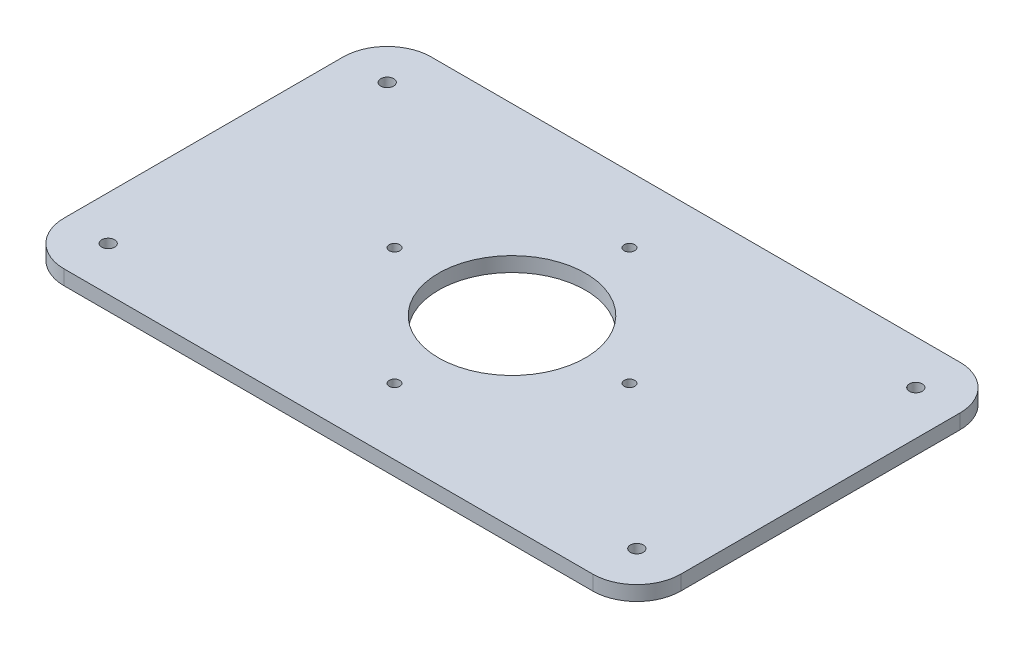
ISO-10303-21;
HEADER;
FILE_DESCRIPTION(('STEP AP214'),'2;1');
FILE_NAME('part.step','',(''),(''),'','','');
FILE_SCHEMA(('AUTOMOTIVE_DESIGN { 1 0 10303 214 1 1 1 1 }'));
ENDSEC;
DATA;
#1=APPLICATION_CONTEXT('core data for automotive mechanical design processes');
#2=APPLICATION_PROTOCOL_DEFINITION('international standard','automotive_design',2000,#1);
#3=PRODUCT_CONTEXT('',#1,'mechanical');
#4=PRODUCT('Part','Part','',(#3));
#5=PRODUCT_RELATED_PRODUCT_CATEGORY('part','',(#4));
#6=PRODUCT_DEFINITION_FORMATION('','',#4);
#7=PRODUCT_DEFINITION_CONTEXT('part definition',#1,'design');
#8=PRODUCT_DEFINITION('design','',#6,#7);
#9=PRODUCT_DEFINITION_SHAPE('','',#8);
#10=(LENGTH_UNIT() NAMED_UNIT(*) SI_UNIT(.MILLI.,.METRE.));
#11=(NAMED_UNIT(*) PLANE_ANGLE_UNIT() SI_UNIT($,.RADIAN.));
#12=(NAMED_UNIT(*) SI_UNIT($,.STERADIAN.) SOLID_ANGLE_UNIT());
#13=UNCERTAINTY_MEASURE_WITH_UNIT(LENGTH_MEASURE(1.E-05),#10,'distance_accuracy_value','');
#14=(GEOMETRIC_REPRESENTATION_CONTEXT(3) GLOBAL_UNCERTAINTY_ASSIGNED_CONTEXT((#13)) GLOBAL_UNIT_ASSIGNED_CONTEXT((#10,
#11,#12)) REPRESENTATION_CONTEXT('',''));
#15=CARTESIAN_POINT('',(0.,0.,0.));
#16=DIRECTION('',(0.,0.,1.));
#17=DIRECTION('',(1.,0.,0.));
#18=AXIS2_PLACEMENT_3D('',#15,#16,#17);
#19=CARTESIAN_POINT('',(0.,5.,0.));
#20=DIRECTION('',(0.,1.,0.));
#21=DIRECTION('',(0.,0.,1.));
#22=AXIS2_PLACEMENT_3D('',#19,#20,#21);
#23=PLANE('',#22);
#24=CARTESIAN_POINT('',(-90.,5.,47.5));
#25=DIRECTION('',(0.,1.,0.));
#26=DIRECTION('',(0.,0.,-1.));
#27=AXIS2_PLACEMENT_3D('',#24,#25,#26);
#28=CIRCLE('',#27,2.20000000000521);
#29=CARTESIAN_POINT('',(-90.,5.,45.2999999999948));
#30=VERTEX_POINT('',#29);
#31=EDGE_CURVE('E219',#30,#30,#28,.T.);
#32=ORIENTED_EDGE('',*,*,#31,.F.);
#33=EDGE_LOOP('',(#32));
#34=FACE_BOUND('',#33,.T.);
#35=CARTESIAN_POINT('',(90.0000000000001,5.,47.5));
#36=DIRECTION('',(0.,1.,0.));
#37=DIRECTION('',(0.,0.,1.));
#38=AXIS2_PLACEMENT_3D('',#35,#36,#37);
#39=CIRCLE('',#38,2.20000000000521);
#40=CARTESIAN_POINT('',(90.0000000000001,5.,49.7000000000053));
#41=VERTEX_POINT('',#40);
#42=EDGE_CURVE('E225',#41,#41,#39,.T.);
#43=ORIENTED_EDGE('',*,*,#42,.F.);
#44=EDGE_LOOP('',(#43));
#45=FACE_BOUND('',#44,.T.);
#46=CARTESIAN_POINT('',(90.0000000000001,5.,-47.5));
#47=DIRECTION('',(0.,1.,0.));
#48=DIRECTION('',(0.,0.,-1.));
#49=AXIS2_PLACEMENT_3D('',#46,#47,#48);
#50=CIRCLE('',#49,2.20000000000521);
#51=CARTESIAN_POINT('',(90.0000000000001,5.,-49.7000000000053));
#52=VERTEX_POINT('',#51);
#53=EDGE_CURVE('E213',#52,#52,#50,.T.);
#54=ORIENTED_EDGE('',*,*,#53,.F.);
#55=EDGE_LOOP('',(#54));
#56=FACE_BOUND('',#55,.T.);
#57=CARTESIAN_POINT('',(-90.,5.,-47.5));
#58=DIRECTION('',(0.,1.,0.));
#59=DIRECTION('',(0.,0.,1.));
#60=AXIS2_PLACEMENT_3D('',#57,#58,#59);
#61=CIRCLE('',#60,2.20000000000521);
#62=CARTESIAN_POINT('',(-90.,5.,-45.2999999999948));
#63=VERTEX_POINT('',#62);
#64=EDGE_CURVE('E210',#63,#63,#61,.T.);
#65=ORIENTED_EDGE('',*,*,#64,.F.);
#66=EDGE_LOOP('',(#65));
#67=FACE_BOUND('',#66,.T.);
#68=CARTESIAN_POINT('',(0.,5.,-40.));
#69=DIRECTION('',(0.,1.,0.));
#70=DIRECTION('',(0.,0.,1.));
#71=AXIS2_PLACEMENT_3D('',#68,#69,#70);
#72=CIRCLE('',#71,1.8);
#73=CARTESIAN_POINT('',(0.,5.,-38.2));
#74=VERTEX_POINT('',#73);
#75=EDGE_CURVE('E145',#74,#74,#72,.T.);
#76=ORIENTED_EDGE('',*,*,#75,.F.);
#77=EDGE_LOOP('',(#76));
#78=FACE_BOUND('',#77,.T.);
#79=CARTESIAN_POINT('',(40.0000000000013,5.,-1.32092536198717E-12));
#80=DIRECTION('',(0.,1.,0.));
#81=DIRECTION('',(0.,0.,1.));
#82=AXIS2_PLACEMENT_3D('',#79,#80,#81);
#83=CIRCLE('',#82,1.8);
#84=CARTESIAN_POINT('',(40.0000000000013,5.,1.79999999999868));
#85=VERTEX_POINT('',#84);
#86=EDGE_CURVE('E148',#85,#85,#83,.T.);
#87=ORIENTED_EDGE('',*,*,#86,.F.);
#88=EDGE_LOOP('',(#87));
#89=FACE_BOUND('',#88,.T.);
#90=CARTESIAN_POINT('',(2.64484859067624E-12,5.,40.));
#91=DIRECTION('',(0.,1.,0.));
#92=DIRECTION('',(0.,0.,1.));
#93=AXIS2_PLACEMENT_3D('',#90,#91,#92);
#94=CIRCLE('',#93,1.8);
#95=CARTESIAN_POINT('',(2.64484859067624E-12,5.,41.8));
#96=VERTEX_POINT('',#95);
#97=EDGE_CURVE('E154',#96,#96,#94,.T.);
#98=ORIENTED_EDGE('',*,*,#97,.F.);
#99=EDGE_LOOP('',(#98));
#100=FACE_BOUND('',#99,.T.);
#101=CARTESIAN_POINT('',(-39.9999999999987,5.,1.32582394918376E-12));
#102=DIRECTION('',(0.,1.,0.));
#103=DIRECTION('',(0.,0.,1.));
#104=AXIS2_PLACEMENT_3D('',#101,#102,#103);
#105=CIRCLE('',#104,1.8);
#106=CARTESIAN_POINT('',(-39.9999999999987,5.,1.80000000000133));
#107=VERTEX_POINT('',#106);
#108=EDGE_CURVE('E160',#107,#107,#105,.T.);
#109=ORIENTED_EDGE('',*,*,#108,.F.);
#110=EDGE_LOOP('',(#109));
#111=FACE_BOUND('',#110,.T.);
#112=CARTESIAN_POINT('',(0.,5.,0.));
#113=DIRECTION('',(0.,1.,0.));
#114=DIRECTION('',(0.,0.,1.));
#115=AXIS2_PLACEMENT_3D('',#112,#113,#114);
#116=CIRCLE('',#115,25.);
#117=CARTESIAN_POINT('',(0.,5.,25.));
#118=VERTEX_POINT('',#117);
#119=EDGE_CURVE('E167',#118,#118,#116,.T.);
#120=ORIENTED_EDGE('',*,*,#119,.F.);
#121=EDGE_LOOP('',(#120));
#122=FACE_BOUND('',#121,.T.);
#123=DIRECTION('',(0.,0.,1.));
#124=VECTOR('',#123,1.);
#125=CARTESIAN_POINT('',(-105.,5.,-62.5));
#126=LINE('',#125,#124);
#127=CARTESIAN_POINT('',(-105.,5.,-47.5));
#128=VERTEX_POINT('',#127);
#129=CARTESIAN_POINT('',(-105.,5.,47.5));
#130=VERTEX_POINT('',#129);
#131=EDGE_CURVE('E140',#128,#130,#126,.T.);
#132=ORIENTED_EDGE('',*,*,#131,.T.);
#133=CARTESIAN_POINT('',(-90.,5.,47.5));
#134=DIRECTION('',(0.,1.,0.));
#135=DIRECTION('',(0.,0.,1.));
#136=AXIS2_PLACEMENT_3D('',#133,#134,#135);
#137=CIRCLE('',#136,15.);
#138=CARTESIAN_POINT('',(-90.,5.,62.5));
#139=VERTEX_POINT('',#138);
#140=EDGE_CURVE('E185',#130,#139,#137,.T.);
#141=ORIENTED_EDGE('',*,*,#140,.T.);
#142=DIRECTION('',(1.,0.,0.));
#143=VECTOR('',#142,1.);
#144=CARTESIAN_POINT('',(-105.,5.,62.5));
#145=LINE('',#144,#143);
#146=CARTESIAN_POINT('',(90.,5.,62.5));
#147=VERTEX_POINT('',#146);
#148=EDGE_CURVE('E123',#139,#147,#145,.T.);
#149=ORIENTED_EDGE('',*,*,#148,.T.);
#150=CARTESIAN_POINT('',(90.,5.,47.5));
#151=DIRECTION('',(0.,1.,0.));
#152=DIRECTION('',(0.,0.,1.));
#153=AXIS2_PLACEMENT_3D('',#150,#151,#152);
#154=CIRCLE('',#153,15.);
#155=CARTESIAN_POINT('',(105.,5.,47.5));
#156=VERTEX_POINT('',#155);
#157=EDGE_CURVE('E183',#147,#156,#154,.T.);
#158=ORIENTED_EDGE('',*,*,#157,.T.);
#159=DIRECTION('',(0.,0.,-1.));
#160=VECTOR('',#159,1.);
#161=CARTESIAN_POINT('',(105.,5.,-62.5));
#162=LINE('',#161,#160);
#163=CARTESIAN_POINT('',(105.,5.,-47.5));
#164=VERTEX_POINT('',#163);
#165=EDGE_CURVE('E196',#156,#164,#162,.T.);
#166=ORIENTED_EDGE('',*,*,#165,.T.);
#167=CARTESIAN_POINT('',(90.,5.,-47.5));
#168=DIRECTION('',(0.,1.,0.));
#169=DIRECTION('',(0.,0.,1.));
#170=AXIS2_PLACEMENT_3D('',#167,#168,#169);
#171=CIRCLE('',#170,15.);
#172=CARTESIAN_POINT('',(90.,5.,-62.5));
#173=VERTEX_POINT('',#172);
#174=EDGE_CURVE('E58',#164,#173,#171,.T.);
#175=ORIENTED_EDGE('',*,*,#174,.T.);
#176=DIRECTION('',(-1.,0.,0.));
#177=VECTOR('',#176,1.);
#178=CARTESIAN_POINT('',(-105.,5.,-62.5));
#179=LINE('',#178,#177);
#180=CARTESIAN_POINT('',(-90.,5.,-62.5));
#181=VERTEX_POINT('',#180);
#182=EDGE_CURVE('E166',#173,#181,#179,.T.);
#183=ORIENTED_EDGE('',*,*,#182,.T.);
#184=CARTESIAN_POINT('',(-90.,5.,-47.5));
#185=DIRECTION('',(0.,1.,0.));
#186=DIRECTION('',(0.,0.,1.));
#187=AXIS2_PLACEMENT_3D('',#184,#185,#186);
#188=CIRCLE('',#187,15.);
#189=EDGE_CURVE('E180',#181,#128,#188,.T.);
#190=ORIENTED_EDGE('',*,*,#189,.T.);
#191=EDGE_LOOP('',(#132,#141,#149,#158,#166,#175,#183,#190));
#192=FACE_BOUND('',#191,.T.);
#193=ADVANCED_FACE('F37',(#34,#45,#56,#67,#78,#89,#100,#111,#122,#192),#23,.T.);
#194=CARTESIAN_POINT('',(0.,0.,0.));
#195=DIRECTION('',(0.,1.,0.));
#196=DIRECTION('',(0.,0.,1.));
#197=AXIS2_PLACEMENT_3D('',#194,#195,#196);
#198=PLANE('',#197);
#199=CARTESIAN_POINT('',(-90.,0.,47.5));
#200=DIRECTION('',(0.,1.,0.));
#201=DIRECTION('',(0.,0.,-1.));
#202=AXIS2_PLACEMENT_3D('',#199,#200,#201);
#203=CIRCLE('',#202,2.20000000000521);
#204=CARTESIAN_POINT('',(-90.,0.,45.2999999999948));
#205=VERTEX_POINT('',#204);
#206=EDGE_CURVE('E216',#205,#205,#203,.T.);
#207=ORIENTED_EDGE('',*,*,#206,.T.);
#208=EDGE_LOOP('',(#207));
#209=FACE_BOUND('',#208,.T.);
#210=CARTESIAN_POINT('',(90.0000000000001,0.,47.5));
#211=DIRECTION('',(0.,1.,0.));
#212=DIRECTION('',(0.,0.,1.));
#213=AXIS2_PLACEMENT_3D('',#210,#211,#212);
#214=CIRCLE('',#213,2.20000000000521);
#215=CARTESIAN_POINT('',(90.0000000000001,0.,49.7000000000053));
#216=VERTEX_POINT('',#215);
#217=EDGE_CURVE('E222',#216,#216,#214,.T.);
#218=ORIENTED_EDGE('',*,*,#217,.T.);
#219=EDGE_LOOP('',(#218));
#220=FACE_BOUND('',#219,.T.);
#221=CARTESIAN_POINT('',(90.0000000000001,0.,-47.5));
#222=DIRECTION('',(0.,1.,0.));
#223=DIRECTION('',(0.,0.,-1.));
#224=AXIS2_PLACEMENT_3D('',#221,#222,#223);
#225=CIRCLE('',#224,2.20000000000521);
#226=CARTESIAN_POINT('',(90.0000000000001,0.,-49.7000000000053));
#227=VERTEX_POINT('',#226);
#228=EDGE_CURVE('E228',#227,#227,#225,.T.);
#229=ORIENTED_EDGE('',*,*,#228,.T.);
#230=EDGE_LOOP('',(#229));
#231=FACE_BOUND('',#230,.T.);
#232=CARTESIAN_POINT('',(-90.,0.,-47.5));
#233=DIRECTION('',(0.,1.,0.));
#234=DIRECTION('',(0.,0.,1.));
#235=AXIS2_PLACEMENT_3D('',#232,#233,#234);
#236=CIRCLE('',#235,2.20000000000521);
#237=CARTESIAN_POINT('',(-90.,0.,-45.2999999999948));
#238=VERTEX_POINT('',#237);
#239=EDGE_CURVE('E135',#238,#238,#236,.T.);
#240=ORIENTED_EDGE('',*,*,#239,.T.);
#241=EDGE_LOOP('',(#240));
#242=FACE_BOUND('',#241,.T.);
#243=CARTESIAN_POINT('',(0.,0.,-40.));
#244=DIRECTION('',(0.,1.,0.));
#245=DIRECTION('',(0.,0.,1.));
#246=AXIS2_PLACEMENT_3D('',#243,#244,#245);
#247=CIRCLE('',#246,1.8);
#248=CARTESIAN_POINT('',(0.,0.,-38.2));
#249=VERTEX_POINT('',#248);
#250=EDGE_CURVE('E141',#249,#249,#247,.T.);
#251=ORIENTED_EDGE('',*,*,#250,.T.);
#252=EDGE_LOOP('',(#251));
#253=FACE_BOUND('',#252,.T.);
#254=CARTESIAN_POINT('',(40.0000000000013,0.,-1.32092536198717E-12));
#255=DIRECTION('',(0.,1.,0.));
#256=DIRECTION('',(0.,0.,1.));
#257=AXIS2_PLACEMENT_3D('',#254,#255,#256);
#258=CIRCLE('',#257,1.8);
#259=CARTESIAN_POINT('',(40.0000000000013,0.,1.79999999999868));
#260=VERTEX_POINT('',#259);
#261=EDGE_CURVE('E151',#260,#260,#258,.T.);
#262=ORIENTED_EDGE('',*,*,#261,.T.);
#263=EDGE_LOOP('',(#262));
#264=FACE_BOUND('',#263,.T.);
#265=CARTESIAN_POINT('',(2.64484859067624E-12,0.,40.));
#266=DIRECTION('',(0.,1.,0.));
#267=DIRECTION('',(0.,0.,1.));
#268=AXIS2_PLACEMENT_3D('',#265,#266,#267);
#269=CIRCLE('',#268,1.8);
#270=CARTESIAN_POINT('',(2.64484859067624E-12,0.,41.8));
#271=VERTEX_POINT('',#270);
#272=EDGE_CURVE('E157',#271,#271,#269,.T.);
#273=ORIENTED_EDGE('',*,*,#272,.T.);
#274=EDGE_LOOP('',(#273));
#275=FACE_BOUND('',#274,.T.);
#276=CARTESIAN_POINT('',(-39.9999999999987,0.,1.32582394918376E-12));
#277=DIRECTION('',(0.,1.,0.));
#278=DIRECTION('',(0.,0.,1.));
#279=AXIS2_PLACEMENT_3D('',#276,#277,#278);
#280=CIRCLE('',#279,1.8);
#281=CARTESIAN_POINT('',(-39.9999999999987,0.,1.80000000000133));
#282=VERTEX_POINT('',#281);
#283=EDGE_CURVE('E163',#282,#282,#280,.T.);
#284=ORIENTED_EDGE('',*,*,#283,.T.);
#285=EDGE_LOOP('',(#284));
#286=FACE_BOUND('',#285,.T.);
#287=CARTESIAN_POINT('',(0.,0.,0.));
#288=DIRECTION('',(0.,1.,0.));
#289=DIRECTION('',(0.,0.,1.));
#290=AXIS2_PLACEMENT_3D('',#287,#288,#289);
#291=CIRCLE('',#290,25.);
#292=CARTESIAN_POINT('',(0.,0.,25.));
#293=VERTEX_POINT('',#292);
#294=EDGE_CURVE('E144',#293,#293,#291,.T.);
#295=ORIENTED_EDGE('',*,*,#294,.T.);
#296=EDGE_LOOP('',(#295));
#297=FACE_BOUND('',#296,.T.);
#298=DIRECTION('',(1.,0.,0.));
#299=VECTOR('',#298,1.);
#300=CARTESIAN_POINT('',(-105.,0.,62.5));
#301=LINE('',#300,#299);
#302=CARTESIAN_POINT('',(-90.,0.,62.5));
#303=VERTEX_POINT('',#302);
#304=CARTESIAN_POINT('',(90.,0.,62.5));
#305=VERTEX_POINT('',#304);
#306=EDGE_CURVE('E120',#303,#305,#301,.T.);
#307=ORIENTED_EDGE('',*,*,#306,.F.);
#308=CARTESIAN_POINT('',(-90.,0.,47.5));
#309=DIRECTION('',(0.,1.,0.));
#310=DIRECTION('',(0.,0.,1.));
#311=AXIS2_PLACEMENT_3D('',#308,#309,#310);
#312=CIRCLE('',#311,15.);
#313=CARTESIAN_POINT('',(-105.,0.,47.5));
#314=VERTEX_POINT('',#313);
#315=EDGE_CURVE('E103',#303,#314,#312,.F.);
#316=ORIENTED_EDGE('',*,*,#315,.T.);
#317=DIRECTION('',(0.,0.,1.));
#318=VECTOR('',#317,1.);
#319=CARTESIAN_POINT('',(-105.,0.,-62.5));
#320=LINE('',#319,#318);
#321=CARTESIAN_POINT('',(-105.,0.,-47.5));
#322=VERTEX_POINT('',#321);
#323=EDGE_CURVE('E130',#322,#314,#320,.T.);
#324=ORIENTED_EDGE('',*,*,#323,.F.);
#325=CARTESIAN_POINT('',(-90.,0.,-47.5));
#326=DIRECTION('',(0.,1.,0.));
#327=DIRECTION('',(0.,0.,1.));
#328=AXIS2_PLACEMENT_3D('',#325,#326,#327);
#329=CIRCLE('',#328,15.);
#330=CARTESIAN_POINT('',(-90.,0.,-62.5));
#331=VERTEX_POINT('',#330);
#332=EDGE_CURVE('E124',#322,#331,#329,.F.);
#333=ORIENTED_EDGE('',*,*,#332,.T.);
#334=DIRECTION('',(-1.,0.,0.));
#335=VECTOR('',#334,1.);
#336=CARTESIAN_POINT('',(-105.,0.,-62.5));
#337=LINE('',#336,#335);
#338=CARTESIAN_POINT('',(90.,0.,-62.5));
#339=VERTEX_POINT('',#338);
#340=EDGE_CURVE('E133',#339,#331,#337,.T.);
#341=ORIENTED_EDGE('',*,*,#340,.F.);
#342=CARTESIAN_POINT('',(90.,0.,-47.5));
#343=DIRECTION('',(0.,1.,0.));
#344=DIRECTION('',(0.,0.,1.));
#345=AXIS2_PLACEMENT_3D('',#342,#343,#344);
#346=CIRCLE('',#345,15.);
#347=CARTESIAN_POINT('',(105.,0.,-47.5));
#348=VERTEX_POINT('',#347);
#349=EDGE_CURVE('E174',#339,#348,#346,.F.);
#350=ORIENTED_EDGE('',*,*,#349,.T.);
#351=DIRECTION('',(0.,0.,-1.));
#352=VECTOR('',#351,1.);
#353=CARTESIAN_POINT('',(105.,0.,-62.5));
#354=LINE('',#353,#352);
#355=CARTESIAN_POINT('',(105.,0.,47.5));
#356=VERTEX_POINT('',#355);
#357=EDGE_CURVE('E129',#356,#348,#354,.T.);
#358=ORIENTED_EDGE('',*,*,#357,.F.);
#359=CARTESIAN_POINT('',(90.,0.,47.5));
#360=DIRECTION('',(0.,1.,0.));
#361=DIRECTION('',(0.,0.,1.));
#362=AXIS2_PLACEMENT_3D('',#359,#360,#361);
#363=CIRCLE('',#362,15.);
#364=EDGE_CURVE('E114',#356,#305,#363,.F.);
#365=ORIENTED_EDGE('',*,*,#364,.T.);
#366=EDGE_LOOP('',(#307,#316,#324,#333,#341,#350,#358,#365));
#367=FACE_BOUND('',#366,.T.);
#368=ADVANCED_FACE('F127',(#209,#220,#231,#242,#253,#264,#275,#286,#297,#367),#198,.F.);
#369=CARTESIAN_POINT('',(0.,5.,0.));
#370=DIRECTION('',(0.,-1.,0.));
#371=DIRECTION('',(0.,0.,-1.));
#372=AXIS2_PLACEMENT_3D('',#369,#370,#371);
#373=CYLINDRICAL_SURFACE('',#372,25.);
#374=ORIENTED_EDGE('',*,*,#119,.T.);
#375=EDGE_LOOP('',(#374));
#376=FACE_BOUND('',#375,.T.);
#377=ORIENTED_EDGE('',*,*,#294,.F.);
#378=EDGE_LOOP('',(#377));
#379=FACE_BOUND('',#378,.T.);
#380=ADVANCED_FACE('F270',(#376,#379),#373,.F.);
#381=CARTESIAN_POINT('',(-39.9999999999987,0.,1.32582394918376E-12));
#382=DIRECTION('',(0.,1.,0.));
#383=DIRECTION('',(0.,0.,1.));
#384=AXIS2_PLACEMENT_3D('',#381,#382,#383);
#385=CYLINDRICAL_SURFACE('',#384,1.8);
#386=ORIENTED_EDGE('',*,*,#283,.F.);
#387=EDGE_LOOP('',(#386));
#388=FACE_BOUND('',#387,.T.);
#389=ORIENTED_EDGE('',*,*,#108,.T.);
#390=EDGE_LOOP('',(#389));
#391=FACE_BOUND('',#390,.T.);
#392=ADVANCED_FACE('F275',(#388,#391),#385,.F.);
#393=CARTESIAN_POINT('',(2.64484859067624E-12,0.,40.));
#394=DIRECTION('',(0.,1.,0.));
#395=DIRECTION('',(0.,0.,1.));
#396=AXIS2_PLACEMENT_3D('',#393,#394,#395);
#397=CYLINDRICAL_SURFACE('',#396,1.8);
#398=ORIENTED_EDGE('',*,*,#272,.F.);
#399=EDGE_LOOP('',(#398));
#400=FACE_BOUND('',#399,.T.);
#401=ORIENTED_EDGE('',*,*,#97,.T.);
#402=EDGE_LOOP('',(#401));
#403=FACE_BOUND('',#402,.T.);
#404=ADVANCED_FACE('F279',(#400,#403),#397,.F.);
#405=CARTESIAN_POINT('',(40.0000000000013,0.,-1.32092536198717E-12));
#406=DIRECTION('',(0.,1.,0.));
#407=DIRECTION('',(0.,0.,1.));
#408=AXIS2_PLACEMENT_3D('',#405,#406,#407);
#409=CYLINDRICAL_SURFACE('',#408,1.8);
#410=ORIENTED_EDGE('',*,*,#261,.F.);
#411=EDGE_LOOP('',(#410));
#412=FACE_BOUND('',#411,.T.);
#413=ORIENTED_EDGE('',*,*,#86,.T.);
#414=EDGE_LOOP('',(#413));
#415=FACE_BOUND('',#414,.T.);
#416=ADVANCED_FACE('F283',(#412,#415),#409,.F.);
#417=CARTESIAN_POINT('',(0.,0.,-40.));
#418=DIRECTION('',(0.,1.,0.));
#419=DIRECTION('',(0.,0.,1.));
#420=AXIS2_PLACEMENT_3D('',#417,#418,#419);
#421=CYLINDRICAL_SURFACE('',#420,1.8);
#422=ORIENTED_EDGE('',*,*,#250,.F.);
#423=EDGE_LOOP('',(#422));
#424=FACE_BOUND('',#423,.T.);
#425=ORIENTED_EDGE('',*,*,#75,.T.);
#426=EDGE_LOOP('',(#425));
#427=FACE_BOUND('',#426,.T.);
#428=ADVANCED_FACE('F287',(#424,#427),#421,.F.);
#429=CARTESIAN_POINT('',(-105.,5.,-62.5));
#430=DIRECTION('',(1.,0.,0.));
#431=DIRECTION('',(0.,0.,-1.));
#432=AXIS2_PLACEMENT_3D('',#429,#430,#431);
#433=PLANE('',#432);
#434=ORIENTED_EDGE('',*,*,#323,.T.);
#435=DIRECTION('',(0.,-1.,0.));
#436=VECTOR('',#435,1.);
#437=CARTESIAN_POINT('',(-105.,5.,47.5));
#438=LINE('',#437,#436);
#439=EDGE_CURVE('E108',#314,#130,#438,.F.);
#440=ORIENTED_EDGE('',*,*,#439,.T.);
#441=ORIENTED_EDGE('',*,*,#131,.F.);
#442=DIRECTION('',(0.,-1.,0.));
#443=VECTOR('',#442,1.);
#444=CARTESIAN_POINT('',(-105.,5.,-47.5));
#445=LINE('',#444,#443);
#446=EDGE_CURVE('E113',#128,#322,#445,.T.);
#447=ORIENTED_EDGE('',*,*,#446,.T.);
#448=EDGE_LOOP('',(#434,#440,#441,#447));
#449=FACE_BOUND('',#448,.T.);
#450=ADVANCED_FACE('F254',(#449),#433,.F.);
#451=CARTESIAN_POINT('',(-105.,5.,62.5));
#452=DIRECTION('',(0.,0.,-1.));
#453=DIRECTION('',(-1.,0.,0.));
#454=AXIS2_PLACEMENT_3D('',#451,#452,#453);
#455=PLANE('',#454);
#456=ORIENTED_EDGE('',*,*,#148,.F.);
#457=DIRECTION('',(0.,-1.,0.));
#458=VECTOR('',#457,1.);
#459=CARTESIAN_POINT('',(-90.,5.,62.5));
#460=LINE('',#459,#458);
#461=EDGE_CURVE('E107',#139,#303,#460,.T.);
#462=ORIENTED_EDGE('',*,*,#461,.T.);
#463=ORIENTED_EDGE('',*,*,#306,.T.);
#464=DIRECTION('',(0.,-1.,0.));
#465=VECTOR('',#464,1.);
#466=CARTESIAN_POINT('',(90.,5.,62.5));
#467=LINE('',#466,#465);
#468=EDGE_CURVE('E125',#305,#147,#467,.F.);
#469=ORIENTED_EDGE('',*,*,#468,.T.);
#470=EDGE_LOOP('',(#456,#462,#463,#469));
#471=FACE_BOUND('',#470,.T.);
#472=ADVANCED_FACE('F119',(#471),#455,.F.);
#473=CARTESIAN_POINT('',(105.,5.,-62.5));
#474=DIRECTION('',(-1.,0.,0.));
#475=DIRECTION('',(0.,0.,1.));
#476=AXIS2_PLACEMENT_3D('',#473,#474,#475);
#477=PLANE('',#476);
#478=ORIENTED_EDGE('',*,*,#165,.F.);
#479=DIRECTION('',(0.,-1.,0.));
#480=VECTOR('',#479,1.);
#481=CARTESIAN_POINT('',(105.,5.,47.5));
#482=LINE('',#481,#480);
#483=EDGE_CURVE('E189',#156,#356,#482,.T.);
#484=ORIENTED_EDGE('',*,*,#483,.T.);
#485=ORIENTED_EDGE('',*,*,#357,.T.);
#486=DIRECTION('',(0.,-1.,0.));
#487=VECTOR('',#486,1.);
#488=CARTESIAN_POINT('',(105.,5.,-47.5));
#489=LINE('',#488,#487);
#490=EDGE_CURVE('E187',#348,#164,#489,.F.);
#491=ORIENTED_EDGE('',*,*,#490,.T.);
#492=EDGE_LOOP('',(#478,#484,#485,#491));
#493=FACE_BOUND('',#492,.T.);
#494=ADVANCED_FACE('F194',(#493),#477,.F.);
#495=CARTESIAN_POINT('',(-105.,5.,-62.5));
#496=DIRECTION('',(0.,0.,1.));
#497=DIRECTION('',(1.,0.,0.));
#498=AXIS2_PLACEMENT_3D('',#495,#496,#497);
#499=PLANE('',#498);
#500=ORIENTED_EDGE('',*,*,#182,.F.);
#501=DIRECTION('',(0.,-1.,0.));
#502=VECTOR('',#501,1.);
#503=CARTESIAN_POINT('',(90.,5.,-62.5));
#504=LINE('',#503,#502);
#505=EDGE_CURVE('E11',#173,#339,#504,.T.);
#506=ORIENTED_EDGE('',*,*,#505,.T.);
#507=ORIENTED_EDGE('',*,*,#340,.T.);
#508=DIRECTION('',(0.,-1.,0.));
#509=VECTOR('',#508,1.);
#510=CARTESIAN_POINT('',(-90.,5.,-62.5));
#511=LINE('',#510,#509);
#512=EDGE_CURVE('E45',#331,#181,#511,.F.);
#513=ORIENTED_EDGE('',*,*,#512,.T.);
#514=EDGE_LOOP('',(#500,#506,#507,#513));
#515=FACE_BOUND('',#514,.T.);
#516=ADVANCED_FACE('F203',(#515),#499,.F.);
#517=CARTESIAN_POINT('',(-90.,0.,-47.5));
#518=DIRECTION('',(0.,1.,0.));
#519=DIRECTION('',(0.,0.,1.));
#520=AXIS2_PLACEMENT_3D('',#517,#518,#519);
#521=CYLINDRICAL_SURFACE('',#520,2.20000000000521);
#522=ORIENTED_EDGE('',*,*,#239,.F.);
#523=EDGE_LOOP('',(#522));
#524=FACE_BOUND('',#523,.T.);
#525=ORIENTED_EDGE('',*,*,#64,.T.);
#526=EDGE_LOOP('',(#525));
#527=FACE_BOUND('',#526,.T.);
#528=ADVANCED_FACE('F300',(#524,#527),#521,.F.);
#529=CARTESIAN_POINT('',(90.0000000000001,0.,-47.5));
#530=DIRECTION('',(0.,1.,0.));
#531=DIRECTION('',(0.,0.,1.));
#532=AXIS2_PLACEMENT_3D('',#529,#530,#531);
#533=CYLINDRICAL_SURFACE('',#532,2.20000000000521);
#534=ORIENTED_EDGE('',*,*,#228,.F.);
#535=EDGE_LOOP('',(#534));
#536=FACE_BOUND('',#535,.T.);
#537=ORIENTED_EDGE('',*,*,#53,.T.);
#538=EDGE_LOOP('',(#537));
#539=FACE_BOUND('',#538,.T.);
#540=ADVANCED_FACE('F234',(#536,#539),#533,.F.);
#541=CARTESIAN_POINT('',(90.0000000000001,0.,47.5));
#542=DIRECTION('',(0.,1.,0.));
#543=DIRECTION('',(0.,0.,1.));
#544=AXIS2_PLACEMENT_3D('',#541,#542,#543);
#545=CYLINDRICAL_SURFACE('',#544,2.20000000000521);
#546=ORIENTED_EDGE('',*,*,#217,.F.);
#547=EDGE_LOOP('',(#546));
#548=FACE_BOUND('',#547,.T.);
#549=ORIENTED_EDGE('',*,*,#42,.T.);
#550=EDGE_LOOP('',(#549));
#551=FACE_BOUND('',#550,.T.);
#552=ADVANCED_FACE('F306',(#548,#551),#545,.F.);
#553=CARTESIAN_POINT('',(-90.,0.,47.5));
#554=DIRECTION('',(0.,1.,0.));
#555=DIRECTION('',(0.,0.,1.));
#556=AXIS2_PLACEMENT_3D('',#553,#554,#555);
#557=CYLINDRICAL_SURFACE('',#556,2.20000000000521);
#558=ORIENTED_EDGE('',*,*,#206,.F.);
#559=EDGE_LOOP('',(#558));
#560=FACE_BOUND('',#559,.T.);
#561=ORIENTED_EDGE('',*,*,#31,.T.);
#562=EDGE_LOOP('',(#561));
#563=FACE_BOUND('',#562,.T.);
#564=ADVANCED_FACE('F268',(#560,#563),#557,.F.);
#565=CARTESIAN_POINT('',(-90.,5.,47.5));
#566=DIRECTION('',(0.,-1.,0.));
#567=DIRECTION('',(0.,0.,-1.));
#568=AXIS2_PLACEMENT_3D('',#565,#566,#567);
#569=CYLINDRICAL_SURFACE('',#568,15.);
#570=ORIENTED_EDGE('',*,*,#140,.F.);
#571=ORIENTED_EDGE('',*,*,#439,.F.);
#572=ORIENTED_EDGE('',*,*,#315,.F.);
#573=ORIENTED_EDGE('',*,*,#461,.F.);
#574=EDGE_LOOP('',(#570,#571,#572,#573));
#575=FACE_BOUND('',#574,.T.);
#576=ADVANCED_FACE('F106',(#575),#569,.T.);
#577=CARTESIAN_POINT('',(90.,5.,47.5));
#578=DIRECTION('',(0.,-1.,0.));
#579=DIRECTION('',(0.,0.,-1.));
#580=AXIS2_PLACEMENT_3D('',#577,#578,#579);
#581=CYLINDRICAL_SURFACE('',#580,15.);
#582=ORIENTED_EDGE('',*,*,#157,.F.);
#583=ORIENTED_EDGE('',*,*,#468,.F.);
#584=ORIENTED_EDGE('',*,*,#364,.F.);
#585=ORIENTED_EDGE('',*,*,#483,.F.);
#586=EDGE_LOOP('',(#582,#583,#584,#585));
#587=FACE_BOUND('',#586,.T.);
#588=ADVANCED_FACE('F260',(#587),#581,.T.);
#589=CARTESIAN_POINT('',(90.,5.,-47.5));
#590=DIRECTION('',(0.,-1.,0.));
#591=DIRECTION('',(0.,0.,-1.));
#592=AXIS2_PLACEMENT_3D('',#589,#590,#591);
#593=CYLINDRICAL_SURFACE('',#592,15.);
#594=ORIENTED_EDGE('',*,*,#174,.F.);
#595=ORIENTED_EDGE('',*,*,#490,.F.);
#596=ORIENTED_EDGE('',*,*,#349,.F.);
#597=ORIENTED_EDGE('',*,*,#505,.F.);
#598=EDGE_LOOP('',(#594,#595,#596,#597));
#599=FACE_BOUND('',#598,.T.);
#600=ADVANCED_FACE('F202',(#599),#593,.T.);
#601=CARTESIAN_POINT('',(-90.,5.,-47.5));
#602=DIRECTION('',(0.,-1.,0.));
#603=DIRECTION('',(0.,0.,-1.));
#604=AXIS2_PLACEMENT_3D('',#601,#602,#603);
#605=CYLINDRICAL_SURFACE('',#604,15.);
#606=ORIENTED_EDGE('',*,*,#189,.F.);
#607=ORIENTED_EDGE('',*,*,#512,.F.);
#608=ORIENTED_EDGE('',*,*,#332,.F.);
#609=ORIENTED_EDGE('',*,*,#446,.F.);
#610=EDGE_LOOP('',(#606,#607,#608,#609));
#611=FACE_BOUND('',#610,.T.);
#612=ADVANCED_FACE('F39',(#611),#605,.T.);
#613=CLOSED_SHELL('',(#193,#368,#380,#392,#404,#416,#428,#450,#472,#494,#516,#528,#540,#552,
#564,#576,#588,#600,#612));
#614=MANIFOLD_SOLID_BREP('B2',#613);
#615=ADVANCED_BREP_SHAPE_REPRESENTATION('',(#18,#614),#14);
#616=SHAPE_DEFINITION_REPRESENTATION(#9,#615);
ENDSEC;
END-ISO-10303-21;
